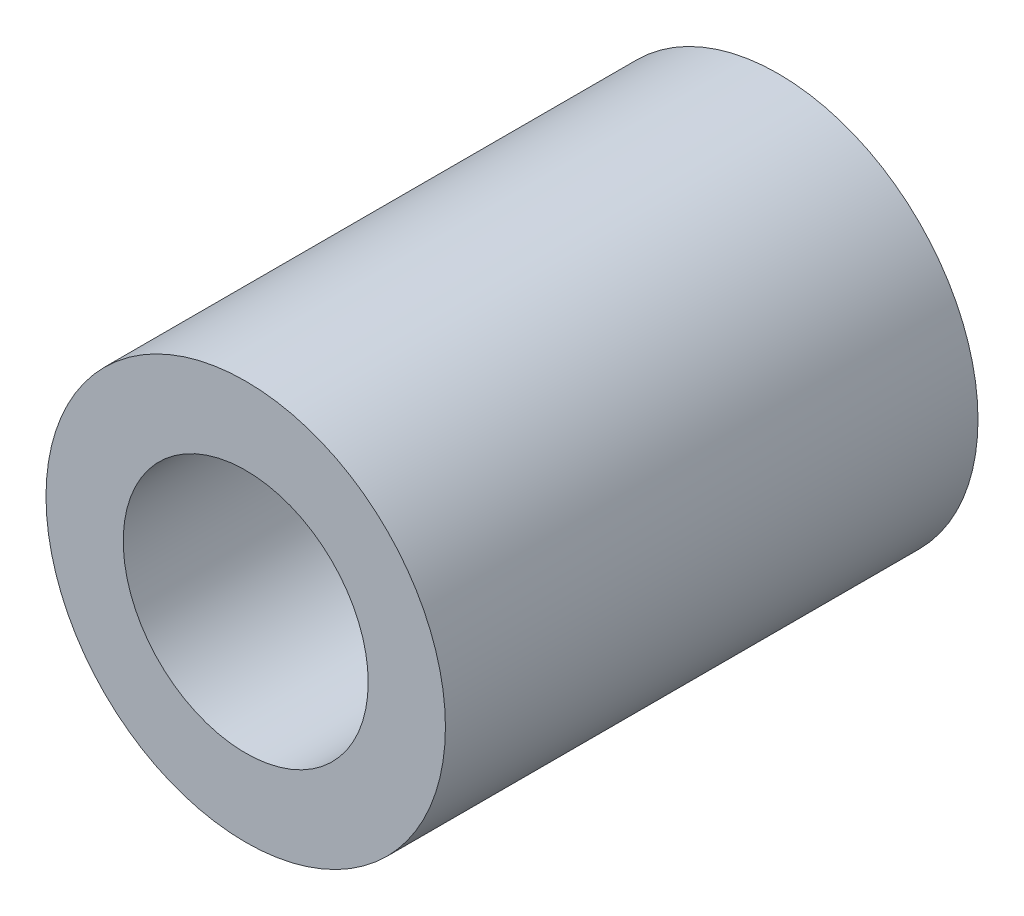
ISO-10303-21;
HEADER;
FILE_DESCRIPTION(('STEP AP214'),'2;1');
FILE_NAME('part.step','',(''),(''),'','','');
FILE_SCHEMA(('AUTOMOTIVE_DESIGN { 1 0 10303 214 1 1 1 1 }'));
ENDSEC;
DATA;
#1=APPLICATION_CONTEXT('core data for automotive mechanical design processes');
#2=APPLICATION_PROTOCOL_DEFINITION('international standard','automotive_design',2000,#1);
#3=PRODUCT_CONTEXT('',#1,'mechanical');
#4=PRODUCT('Part','Part','',(#3));
#5=PRODUCT_RELATED_PRODUCT_CATEGORY('part','',(#4));
#6=PRODUCT_DEFINITION_FORMATION('','',#4);
#7=PRODUCT_DEFINITION_CONTEXT('part definition',#1,'design');
#8=PRODUCT_DEFINITION('design','',#6,#7);
#9=PRODUCT_DEFINITION_SHAPE('','',#8);
#10=(LENGTH_UNIT() NAMED_UNIT(*) SI_UNIT(.MILLI.,.METRE.));
#11=(NAMED_UNIT(*) PLANE_ANGLE_UNIT() SI_UNIT($,.RADIAN.));
#12=(NAMED_UNIT(*) SI_UNIT($,.STERADIAN.) SOLID_ANGLE_UNIT());
#13=UNCERTAINTY_MEASURE_WITH_UNIT(LENGTH_MEASURE(1.E-05),#10,'distance_accuracy_value','');
#14=(GEOMETRIC_REPRESENTATION_CONTEXT(3) GLOBAL_UNCERTAINTY_ASSIGNED_CONTEXT((#13)) GLOBAL_UNIT_ASSIGNED_CONTEXT((#10,
#11,#12)) REPRESENTATION_CONTEXT('',''));
#15=CARTESIAN_POINT('',(0.,0.,0.));
#16=DIRECTION('',(0.,0.,1.));
#17=DIRECTION('',(1.,0.,0.));
#18=AXIS2_PLACEMENT_3D('',#15,#16,#17);
#19=CARTESIAN_POINT('',(0.,0.,3.175));
#20=DIRECTION('',(0.,0.,1.));
#21=DIRECTION('',(1.,0.,0.));
#22=AXIS2_PLACEMENT_3D('',#19,#20,#21);
#23=PLANE('',#22);
#24=CARTESIAN_POINT('',(0.,0.,3.175));
#25=DIRECTION('',(0.,0.,1.));
#26=DIRECTION('',(1.,0.,0.));
#27=AXIS2_PLACEMENT_3D('',#24,#25,#26);
#28=CIRCLE('',#27,2.38125);
#29=CARTESIAN_POINT('',(2.38125,0.,3.175));
#30=VERTEX_POINT('',#29);
#31=EDGE_CURVE('E10',#30,#30,#28,.T.);
#32=ORIENTED_EDGE('',*,*,#31,.T.);
#33=EDGE_LOOP('',(#32));
#34=FACE_BOUND('',#33,.T.);
#35=CARTESIAN_POINT('',(0.,0.,3.175));
#36=DIRECTION('',(0.,0.,1.));
#37=DIRECTION('',(1.,0.,0.));
#38=AXIS2_PLACEMENT_3D('',#35,#36,#37);
#39=CIRCLE('',#38,1.4605);
#40=CARTESIAN_POINT('',(1.4605,0.,3.175));
#41=VERTEX_POINT('',#40);
#42=EDGE_CURVE('E43',#41,#41,#39,.T.);
#43=ORIENTED_EDGE('',*,*,#42,.F.);
#44=EDGE_LOOP('',(#43));
#45=FACE_BOUND('',#44,.T.);
#46=ADVANCED_FACE('F32',(#34,#45),#23,.T.);
#47=CARTESIAN_POINT('',(0.,0.,-3.175));
#48=DIRECTION('',(0.,0.,1.));
#49=DIRECTION('',(1.,0.,0.));
#50=AXIS2_PLACEMENT_3D('',#47,#48,#49);
#51=PLANE('',#50);
#52=CARTESIAN_POINT('',(0.,0.,-3.175));
#53=DIRECTION('',(0.,0.,1.));
#54=DIRECTION('',(1.,0.,0.));
#55=AXIS2_PLACEMENT_3D('',#52,#53,#54);
#56=CIRCLE('',#55,2.38125);
#57=CARTESIAN_POINT('',(2.38125,0.,-3.175));
#58=VERTEX_POINT('',#57);
#59=EDGE_CURVE('E36',#58,#58,#56,.T.);
#60=ORIENTED_EDGE('',*,*,#59,.F.);
#61=EDGE_LOOP('',(#60));
#62=FACE_BOUND('',#61,.T.);
#63=CARTESIAN_POINT('',(0.,0.,-3.175));
#64=DIRECTION('',(0.,0.,1.));
#65=DIRECTION('',(1.,0.,0.));
#66=AXIS2_PLACEMENT_3D('',#63,#64,#65);
#67=CIRCLE('',#66,1.4605);
#68=CARTESIAN_POINT('',(1.4605,0.,-3.175));
#69=VERTEX_POINT('',#68);
#70=EDGE_CURVE('E45',#69,#69,#67,.T.);
#71=ORIENTED_EDGE('',*,*,#70,.T.);
#72=EDGE_LOOP('',(#71));
#73=FACE_BOUND('',#72,.T.);
#74=ADVANCED_FACE('F55',(#62,#73),#51,.F.);
#75=CARTESIAN_POINT('',(0.,0.,3.175));
#76=DIRECTION('',(0.,0.,-1.));
#77=DIRECTION('',(-1.,0.,0.));
#78=AXIS2_PLACEMENT_3D('',#75,#76,#77);
#79=CYLINDRICAL_SURFACE('',#78,2.38125);
#80=ORIENTED_EDGE('',*,*,#31,.F.);
#81=EDGE_LOOP('',(#80));
#82=FACE_BOUND('',#81,.T.);
#83=ORIENTED_EDGE('',*,*,#59,.T.);
#84=EDGE_LOOP('',(#83));
#85=FACE_BOUND('',#84,.T.);
#86=ADVANCED_FACE('F34',(#82,#85),#79,.T.);
#87=CARTESIAN_POINT('',(0.,0.,3.175));
#88=DIRECTION('',(0.,0.,-1.));
#89=DIRECTION('',(-1.,0.,0.));
#90=AXIS2_PLACEMENT_3D('',#87,#88,#89);
#91=CYLINDRICAL_SURFACE('',#90,1.4605);
#92=ORIENTED_EDGE('',*,*,#42,.T.);
#93=EDGE_LOOP('',(#92));
#94=FACE_BOUND('',#93,.T.);
#95=ORIENTED_EDGE('',*,*,#70,.F.);
#96=EDGE_LOOP('',(#95));
#97=FACE_BOUND('',#96,.T.);
#98=ADVANCED_FACE('F51',(#94,#97),#91,.F.);
#99=CLOSED_SHELL('',(#46,#74,#86,#98));
#100=MANIFOLD_SOLID_BREP('B2',#99);
#101=ADVANCED_BREP_SHAPE_REPRESENTATION('',(#18,#100),#14);
#102=SHAPE_DEFINITION_REPRESENTATION(#9,#101);
ENDSEC;
END-ISO-10303-21;
